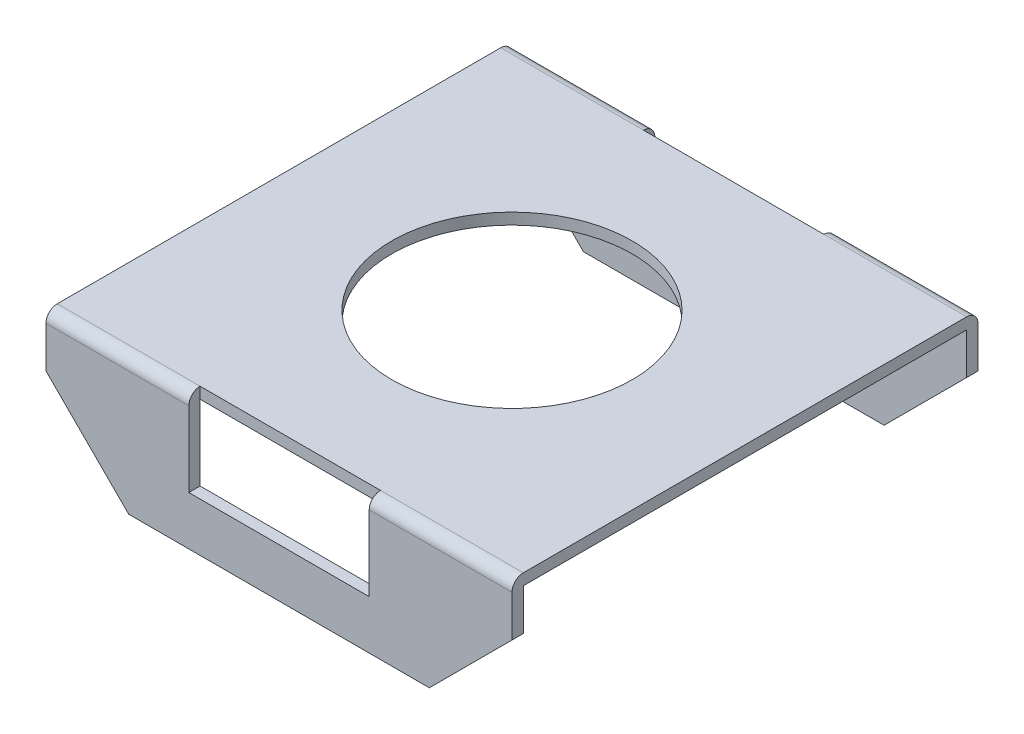
ISO-10303-21;
HEADER;
FILE_DESCRIPTION(('STEP AP214'),'2;1');
FILE_NAME('part.step','',(''),(''),'','','');
FILE_SCHEMA(('AUTOMOTIVE_DESIGN { 1 0 10303 214 1 1 1 1 }'));
ENDSEC;
DATA;
#1=APPLICATION_CONTEXT('core data for automotive mechanical design processes');
#2=APPLICATION_PROTOCOL_DEFINITION('international standard','automotive_design',2000,#1);
#3=PRODUCT_CONTEXT('',#1,'mechanical');
#4=PRODUCT('Part','Part','',(#3));
#5=PRODUCT_RELATED_PRODUCT_CATEGORY('part','',(#4));
#6=PRODUCT_DEFINITION_FORMATION('','',#4);
#7=PRODUCT_DEFINITION_CONTEXT('part definition',#1,'design');
#8=PRODUCT_DEFINITION('design','',#6,#7);
#9=PRODUCT_DEFINITION_SHAPE('','',#8);
#10=(LENGTH_UNIT() NAMED_UNIT(*) SI_UNIT(.MILLI.,.METRE.));
#11=(NAMED_UNIT(*) PLANE_ANGLE_UNIT() SI_UNIT($,.RADIAN.));
#12=(NAMED_UNIT(*) SI_UNIT($,.STERADIAN.) SOLID_ANGLE_UNIT());
#13=UNCERTAINTY_MEASURE_WITH_UNIT(LENGTH_MEASURE(1.E-05),#10,'distance_accuracy_value','');
#14=(GEOMETRIC_REPRESENTATION_CONTEXT(3) GLOBAL_UNCERTAINTY_ASSIGNED_CONTEXT((#13)) GLOBAL_UNIT_ASSIGNED_CONTEXT((#10,
#11,#12)) REPRESENTATION_CONTEXT('',''));
#15=CARTESIAN_POINT('',(0.,0.,0.));
#16=DIRECTION('',(0.,0.,1.));
#17=DIRECTION('',(1.,0.,0.));
#18=AXIS2_PLACEMENT_3D('',#15,#16,#17);
#19=CARTESIAN_POINT('',(3.1,2.,-2.95));
#20=DIRECTION('',(0.,0.,-1.));
#21=DIRECTION('',(-1.,0.,0.));
#22=AXIS2_PLACEMENT_3D('',#19,#20,#21);
#23=PLANE('',#22);
#24=DIRECTION('',(-1.,0.,0.));
#25=VECTOR('',#24,1.);
#26=CARTESIAN_POINT('',(3.1,0.2,-2.95));
#27=LINE('',#26,#25);
#28=CARTESIAN_POINT('',(2.,0.2,-2.95));
#29=VERTEX_POINT('',#28);
#30=CARTESIAN_POINT('',(-2.,0.2,-2.95));
#31=VERTEX_POINT('',#30);
#32=EDGE_CURVE('E295',#29,#31,#27,.T.);
#33=ORIENTED_EDGE('',*,*,#32,.F.);
#34=DIRECTION('',(0.707106781186551,0.707106781186544,0.));
#35=VECTOR('',#34,1.);
#36=CARTESIAN_POINT('',(3.45000000000001,1.64999999999999,-2.95));
#37=LINE('',#36,#35);
#38=CARTESIAN_POINT('',(3.1,1.29999999999999,-2.95));
#39=VERTEX_POINT('',#38);
#40=EDGE_CURVE('E376',#29,#39,#37,.T.);
#41=ORIENTED_EDGE('',*,*,#40,.T.);
#42=DIRECTION('',(0.,1.,0.));
#43=VECTOR('',#42,1.);
#44=CARTESIAN_POINT('',(3.1,2.,-2.95));
#45=LINE('',#44,#43);
#46=CARTESIAN_POINT('',(3.1,1.85,-2.95));
#47=VERTEX_POINT('',#46);
#48=EDGE_CURVE('E281',#47,#39,#45,.F.);
#49=ORIENTED_EDGE('',*,*,#48,.F.);
#50=DIRECTION('',(-1.,0.,0.));
#51=VECTOR('',#50,1.);
#52=CARTESIAN_POINT('',(3.1,1.85,-2.95));
#53=LINE('',#52,#51);
#54=CARTESIAN_POINT('',(1.2,1.85,-2.95));
#55=VERTEX_POINT('',#54);
#56=EDGE_CURVE('E282',#47,#55,#53,.T.);
#57=ORIENTED_EDGE('',*,*,#56,.T.);
#58=DIRECTION('',(0.,-1.,0.));
#59=VECTOR('',#58,1.);
#60=CARTESIAN_POINT('',(1.2,2.,-2.95));
#61=LINE('',#60,#59);
#62=CARTESIAN_POINT('',(1.2,0.85,-2.95));
#63=VERTEX_POINT('',#62);
#64=EDGE_CURVE('E326',#55,#63,#61,.T.);
#65=ORIENTED_EDGE('',*,*,#64,.T.);
#66=DIRECTION('',(-1.,0.,0.));
#67=VECTOR('',#66,1.);
#68=CARTESIAN_POINT('',(3.1,0.85,-2.95));
#69=LINE('',#68,#67);
#70=CARTESIAN_POINT('',(-1.2,0.85,-2.95));
#71=VERTEX_POINT('',#70);
#72=EDGE_CURVE('E331',#63,#71,#69,.T.);
#73=ORIENTED_EDGE('',*,*,#72,.T.);
#74=DIRECTION('',(0.,1.,0.));
#75=VECTOR('',#74,1.);
#76=CARTESIAN_POINT('',(-1.2,2.,-2.95));
#77=LINE('',#76,#75);
#78=CARTESIAN_POINT('',(-1.2,1.85,-2.95));
#79=VERTEX_POINT('',#78);
#80=EDGE_CURVE('E329',#71,#79,#77,.T.);
#81=ORIENTED_EDGE('',*,*,#80,.T.);
#82=CARTESIAN_POINT('',(-3.1,1.85,-2.95));
#83=VERTEX_POINT('',#82);
#84=EDGE_CURVE('E286',#79,#83,#53,.T.);
#85=ORIENTED_EDGE('',*,*,#84,.T.);
#86=DIRECTION('',(0.,1.,0.));
#87=VECTOR('',#86,1.);
#88=CARTESIAN_POINT('',(-3.1,2.,-2.95));
#89=LINE('',#88,#87);
#90=CARTESIAN_POINT('',(-3.1,1.29999999999999,-2.95));
#91=VERTEX_POINT('',#90);
#92=EDGE_CURVE('E334',#83,#91,#89,.F.);
#93=ORIENTED_EDGE('',*,*,#92,.T.);
#94=DIRECTION('',(0.707106781186552,-0.707106781186544,0.));
#95=VECTOR('',#94,1.);
#96=CARTESIAN_POINT('',(-0.349999999999971,-1.45000000000001,-2.95));
#97=LINE('',#96,#95);
#98=EDGE_CURVE('E364',#91,#31,#97,.T.);
#99=ORIENTED_EDGE('',*,*,#98,.T.);
#100=EDGE_LOOP('',(#33,#41,#49,#57,#65,#73,#81,#85,#93,#99));
#101=FACE_BOUND('',#100,.T.);
#102=ADVANCED_FACE('F32',(#101),#23,.F.);
#103=CARTESIAN_POINT('',(3.1,0.2,-3.1));
#104=DIRECTION('',(0.,-1.,0.));
#105=DIRECTION('',(0.,0.,-1.));
#106=AXIS2_PLACEMENT_3D('',#103,#104,#105);
#107=PLANE('',#106);
#108=DIRECTION('',(0.,0.,1.));
#109=VECTOR('',#108,1.);
#110=CARTESIAN_POINT('',(2.,0.2,-3.1));
#111=LINE('',#110,#109);
#112=CARTESIAN_POINT('',(2.,0.2,-3.1));
#113=VERTEX_POINT('',#112);
#114=EDGE_CURVE('E441',#113,#29,#111,.T.);
#115=ORIENTED_EDGE('',*,*,#114,.T.);
#116=ORIENTED_EDGE('',*,*,#32,.T.);
#117=DIRECTION('',(0.,0.,1.));
#118=VECTOR('',#117,1.);
#119=CARTESIAN_POINT('',(-2.,0.2,-3.1));
#120=LINE('',#119,#118);
#121=CARTESIAN_POINT('',(-2.,0.2,-3.1));
#122=VERTEX_POINT('',#121);
#123=EDGE_CURVE('E366',#122,#31,#120,.T.);
#124=ORIENTED_EDGE('',*,*,#123,.F.);
#125=DIRECTION('',(-1.,0.,0.));
#126=VECTOR('',#125,1.);
#127=CARTESIAN_POINT('',(3.1,0.2,-3.1));
#128=LINE('',#127,#126);
#129=EDGE_CURVE('E293',#113,#122,#128,.T.);
#130=ORIENTED_EDGE('',*,*,#129,.F.);
#131=EDGE_LOOP('',(#115,#116,#124,#130));
#132=FACE_BOUND('',#131,.T.);
#133=ADVANCED_FACE('F481',(#132),#107,.T.);
#134=CARTESIAN_POINT('',(3.1,2.,-3.1));
#135=DIRECTION('',(0.,0.,-1.));
#136=DIRECTION('',(-1.,0.,0.));
#137=AXIS2_PLACEMENT_3D('',#134,#135,#136);
#138=PLANE('',#137);
#139=DIRECTION('',(0.,-1.,0.));
#140=VECTOR('',#139,1.);
#141=CARTESIAN_POINT('',(-3.1,2.,-3.1));
#142=LINE('',#141,#140);
#143=CARTESIAN_POINT('',(-3.1,1.85,-3.1));
#144=VERTEX_POINT('',#143);
#145=CARTESIAN_POINT('',(-3.1,1.29999999999999,-3.1));
#146=VERTEX_POINT('',#145);
#147=EDGE_CURVE('E275',#144,#146,#142,.T.);
#148=ORIENTED_EDGE('',*,*,#147,.F.);
#149=DIRECTION('',(-1.,0.,0.));
#150=VECTOR('',#149,1.);
#151=CARTESIAN_POINT('',(3.1,1.85,-3.1));
#152=LINE('',#151,#150);
#153=CARTESIAN_POINT('',(-1.2,1.85,-3.1));
#154=VERTEX_POINT('',#153);
#155=EDGE_CURVE('E241',#144,#154,#152,.F.);
#156=ORIENTED_EDGE('',*,*,#155,.T.);
#157=DIRECTION('',(0.,-1.,0.));
#158=VECTOR('',#157,1.);
#159=CARTESIAN_POINT('',(-1.2,1.85,-3.1));
#160=LINE('',#159,#158);
#161=CARTESIAN_POINT('',(-1.2,0.85,-3.1));
#162=VERTEX_POINT('',#161);
#163=EDGE_CURVE('E387',#154,#162,#160,.T.);
#164=ORIENTED_EDGE('',*,*,#163,.T.);
#165=DIRECTION('',(1.,0.,0.));
#166=VECTOR('',#165,1.);
#167=CARTESIAN_POINT('',(-1.2,0.85,-3.1));
#168=LINE('',#167,#166);
#169=CARTESIAN_POINT('',(1.2,0.85,-3.1));
#170=VERTEX_POINT('',#169);
#171=EDGE_CURVE('E320',#162,#170,#168,.T.);
#172=ORIENTED_EDGE('',*,*,#171,.T.);
#173=DIRECTION('',(0.,1.,0.));
#174=VECTOR('',#173,1.);
#175=CARTESIAN_POINT('',(1.2,1.85,-3.1));
#176=LINE('',#175,#174);
#177=CARTESIAN_POINT('',(1.2,1.85,-3.1));
#178=VERTEX_POINT('',#177);
#179=EDGE_CURVE('E317',#170,#178,#176,.T.);
#180=ORIENTED_EDGE('',*,*,#179,.T.);
#181=DIRECTION('',(-1.,0.,0.));
#182=VECTOR('',#181,1.);
#183=CARTESIAN_POINT('',(3.1,1.85,-3.1));
#184=LINE('',#183,#182);
#185=CARTESIAN_POINT('',(3.1,1.85,-3.1));
#186=VERTEX_POINT('',#185);
#187=EDGE_CURVE('E239',#178,#186,#184,.F.);
#188=ORIENTED_EDGE('',*,*,#187,.T.);
#189=DIRECTION('',(0.,-1.,0.));
#190=VECTOR('',#189,1.);
#191=CARTESIAN_POINT('',(3.1,2.,-3.1));
#192=LINE('',#191,#190);
#193=CARTESIAN_POINT('',(3.1,1.29999999999999,-3.1));
#194=VERTEX_POINT('',#193);
#195=EDGE_CURVE('E337',#186,#194,#192,.T.);
#196=ORIENTED_EDGE('',*,*,#195,.T.);
#197=DIRECTION('',(-0.707106781186551,-0.707106781186544,0.));
#198=VECTOR('',#197,1.);
#199=CARTESIAN_POINT('',(3.1,1.29999999999999,-3.1));
#200=LINE('',#199,#198);
#201=EDGE_CURVE('E435',#194,#113,#200,.T.);
#202=ORIENTED_EDGE('',*,*,#201,.T.);
#203=ORIENTED_EDGE('',*,*,#129,.T.);
#204=DIRECTION('',(-0.707106781186551,0.707106781186543,0.));
#205=VECTOR('',#204,1.);
#206=CARTESIAN_POINT('',(-3.1,1.29999999999999,-3.1));
#207=LINE('',#206,#205);
#208=EDGE_CURVE('E361',#122,#146,#207,.T.);
#209=ORIENTED_EDGE('',*,*,#208,.T.);
#210=EDGE_LOOP('',(#148,#156,#164,#172,#180,#188,#196,#202,#203,#209));
#211=FACE_BOUND('',#210,.T.);
#212=ADVANCED_FACE('F368',(#211),#138,.T.);
#213=CARTESIAN_POINT('',(3.1,2.,3.1));
#214=DIRECTION('',(0.,1.,0.));
#215=DIRECTION('',(0.,0.,1.));
#216=AXIS2_PLACEMENT_3D('',#213,#214,#215);
#217=PLANE('',#216);
#218=CARTESIAN_POINT('',(0.,2.,0.));
#219=DIRECTION('',(0.,1.,0.));
#220=DIRECTION('',(0.,0.,1.));
#221=AXIS2_PLACEMENT_3D('',#218,#219,#220);
#222=CIRCLE('',#221,1.6);
#223=CARTESIAN_POINT('',(0.,2.,1.6));
#224=VERTEX_POINT('',#223);
#225=EDGE_CURVE('E709',#224,#224,#222,.T.);
#226=ORIENTED_EDGE('',*,*,#225,.F.);
#227=EDGE_LOOP('',(#226));
#228=FACE_BOUND('',#227,.T.);
#229=DIRECTION('',(1.,0.,0.));
#230=VECTOR('',#229,1.);
#231=CARTESIAN_POINT('',(-1.2,2.,-2.95));
#232=LINE('',#231,#230);
#233=CARTESIAN_POINT('',(-1.2,2.,-2.95));
#234=VERTEX_POINT('',#233);
#235=CARTESIAN_POINT('',(1.2,2.,-2.95));
#236=VERTEX_POINT('',#235);
#237=EDGE_CURVE('E425',#234,#236,#232,.T.);
#238=ORIENTED_EDGE('',*,*,#237,.F.);
#239=DIRECTION('',(-1.,0.,0.));
#240=VECTOR('',#239,1.);
#241=CARTESIAN_POINT('',(3.1,2.,-2.95));
#242=LINE('',#241,#240);
#243=CARTESIAN_POINT('',(-3.1,2.,-2.95));
#244=VERTEX_POINT('',#243);
#245=EDGE_CURVE('E232',#234,#244,#242,.T.);
#246=ORIENTED_EDGE('',*,*,#245,.T.);
#247=DIRECTION('',(0.,0.,-1.));
#248=VECTOR('',#247,1.);
#249=CARTESIAN_POINT('',(-3.1,2.,3.1));
#250=LINE('',#249,#248);
#251=CARTESIAN_POINT('',(-3.1,2.,2.95));
#252=VERTEX_POINT('',#251);
#253=EDGE_CURVE('E271',#252,#244,#250,.T.);
#254=ORIENTED_EDGE('',*,*,#253,.F.);
#255=DIRECTION('',(-1.,0.,0.));
#256=VECTOR('',#255,1.);
#257=CARTESIAN_POINT('',(3.1,2.,2.95));
#258=LINE('',#257,#256);
#259=CARTESIAN_POINT('',(-1.2,2.,2.95));
#260=VERTEX_POINT('',#259);
#261=EDGE_CURVE('E218',#252,#260,#258,.F.);
#262=ORIENTED_EDGE('',*,*,#261,.T.);
#263=DIRECTION('',(-1.,0.,0.));
#264=VECTOR('',#263,1.);
#265=CARTESIAN_POINT('',(-1.2,2.,2.95));
#266=LINE('',#265,#264);
#267=CARTESIAN_POINT('',(1.2,2.,2.95));
#268=VERTEX_POINT('',#267);
#269=EDGE_CURVE('E204',#268,#260,#266,.T.);
#270=ORIENTED_EDGE('',*,*,#269,.F.);
#271=DIRECTION('',(-1.,0.,0.));
#272=VECTOR('',#271,1.);
#273=CARTESIAN_POINT('',(3.1,2.,2.95));
#274=LINE('',#273,#272);
#275=CARTESIAN_POINT('',(3.1,2.,2.95));
#276=VERTEX_POINT('',#275);
#277=EDGE_CURVE('E214',#268,#276,#274,.F.);
#278=ORIENTED_EDGE('',*,*,#277,.T.);
#279=DIRECTION('',(0.,0.,-1.));
#280=VECTOR('',#279,1.);
#281=CARTESIAN_POINT('',(3.1,2.,3.1));
#282=LINE('',#281,#280);
#283=CARTESIAN_POINT('',(3.1,2.,-2.95));
#284=VERTEX_POINT('',#283);
#285=EDGE_CURVE('E339',#276,#284,#282,.T.);
#286=ORIENTED_EDGE('',*,*,#285,.T.);
#287=DIRECTION('',(-1.,0.,0.));
#288=VECTOR('',#287,1.);
#289=CARTESIAN_POINT('',(3.1,2.,-2.95));
#290=LINE('',#289,#288);
#291=EDGE_CURVE('E224',#284,#236,#290,.T.);
#292=ORIENTED_EDGE('',*,*,#291,.T.);
#293=EDGE_LOOP('',(#238,#246,#254,#262,#270,#278,#286,#292));
#294=FACE_BOUND('',#293,.T.);
#295=ADVANCED_FACE('F212',(#228,#294),#217,.T.);
#296=CARTESIAN_POINT('',(3.1,0.2,3.1));
#297=DIRECTION('',(0.,0.,1.));
#298=DIRECTION('',(1.,0.,0.));
#299=AXIS2_PLACEMENT_3D('',#296,#297,#298);
#300=PLANE('',#299);
#301=DIRECTION('',(0.,-1.,0.));
#302=VECTOR('',#301,1.);
#303=CARTESIAN_POINT('',(-1.2,1.85,3.1));
#304=LINE('',#303,#302);
#305=CARTESIAN_POINT('',(-1.2,1.85,3.1));
#306=VERTEX_POINT('',#305);
#307=CARTESIAN_POINT('',(-1.2,0.85,3.1));
#308=VERTEX_POINT('',#307);
#309=EDGE_CURVE('E263',#306,#308,#304,.T.);
#310=ORIENTED_EDGE('',*,*,#309,.F.);
#311=DIRECTION('',(-1.,0.,0.));
#312=VECTOR('',#311,1.);
#313=CARTESIAN_POINT('',(3.1,1.85,3.1));
#314=LINE('',#313,#312);
#315=CARTESIAN_POINT('',(-3.1,1.85,3.1));
#316=VERTEX_POINT('',#315);
#317=EDGE_CURVE('E252',#306,#316,#314,.T.);
#318=ORIENTED_EDGE('',*,*,#317,.T.);
#319=DIRECTION('',(0.,1.,0.));
#320=VECTOR('',#319,1.);
#321=CARTESIAN_POINT('',(-3.1,0.2,3.1));
#322=LINE('',#321,#320);
#323=CARTESIAN_POINT('',(-3.1,1.29999999999999,3.1));
#324=VERTEX_POINT('',#323);
#325=EDGE_CURVE('E261',#324,#316,#322,.T.);
#326=ORIENTED_EDGE('',*,*,#325,.F.);
#327=DIRECTION('',(-0.707106781186551,0.707106781186543,0.));
#328=VECTOR('',#327,1.);
#329=CARTESIAN_POINT('',(-3.1,1.29999999999999,3.1));
#330=LINE('',#329,#328);
#331=CARTESIAN_POINT('',(-2.,0.2,3.1));
#332=VERTEX_POINT('',#331);
#333=EDGE_CURVE('E372',#332,#324,#330,.T.);
#334=ORIENTED_EDGE('',*,*,#333,.F.);
#335=DIRECTION('',(-1.,0.,0.));
#336=VECTOR('',#335,1.);
#337=CARTESIAN_POINT('',(3.1,0.2,3.1));
#338=LINE('',#337,#336);
#339=CARTESIAN_POINT('',(2.,0.2,3.1));
#340=VERTEX_POINT('',#339);
#341=EDGE_CURVE('E291',#340,#332,#338,.T.);
#342=ORIENTED_EDGE('',*,*,#341,.F.);
#343=DIRECTION('',(-0.707106781186551,-0.707106781186544,0.));
#344=VECTOR('',#343,1.);
#345=CARTESIAN_POINT('',(3.1,1.29999999999999,3.1));
#346=LINE('',#345,#344);
#347=CARTESIAN_POINT('',(3.1,1.29999999999999,3.1));
#348=VERTEX_POINT('',#347);
#349=EDGE_CURVE('E405',#348,#340,#346,.T.);
#350=ORIENTED_EDGE('',*,*,#349,.F.);
#351=DIRECTION('',(0.,1.,0.));
#352=VECTOR('',#351,1.);
#353=CARTESIAN_POINT('',(3.1,0.2,3.1));
#354=LINE('',#353,#352);
#355=CARTESIAN_POINT('',(3.1,1.85,3.1));
#356=VERTEX_POINT('',#355);
#357=EDGE_CURVE('E341',#348,#356,#354,.T.);
#358=ORIENTED_EDGE('',*,*,#357,.T.);
#359=DIRECTION('',(-1.,0.,0.));
#360=VECTOR('',#359,1.);
#361=CARTESIAN_POINT('',(3.1,1.85,3.1));
#362=LINE('',#361,#360);
#363=CARTESIAN_POINT('',(1.2,1.85,3.1));
#364=VERTEX_POINT('',#363);
#365=EDGE_CURVE('E250',#356,#364,#362,.T.);
#366=ORIENTED_EDGE('',*,*,#365,.T.);
#367=DIRECTION('',(0.,1.,0.));
#368=VECTOR('',#367,1.);
#369=CARTESIAN_POINT('',(1.2,1.85,3.1));
#370=LINE('',#369,#368);
#371=CARTESIAN_POINT('',(1.2,0.85,3.1));
#372=VERTEX_POINT('',#371);
#373=EDGE_CURVE('E199',#372,#364,#370,.T.);
#374=ORIENTED_EDGE('',*,*,#373,.F.);
#375=DIRECTION('',(1.,0.,0.));
#376=VECTOR('',#375,1.);
#377=CARTESIAN_POINT('',(-1.2,0.85,3.1));
#378=LINE('',#377,#376);
#379=EDGE_CURVE('E384',#308,#372,#378,.T.);
#380=ORIENTED_EDGE('',*,*,#379,.F.);
#381=EDGE_LOOP('',(#310,#318,#326,#334,#342,#350,#358,#366,#374,#380));
#382=FACE_BOUND('',#381,.T.);
#383=ADVANCED_FACE('F259',(#382),#300,.T.);
#384=CARTESIAN_POINT('',(3.1,0.2,2.95));
#385=DIRECTION('',(0.,-1.,0.));
#386=DIRECTION('',(0.,0.,-1.));
#387=AXIS2_PLACEMENT_3D('',#384,#385,#386);
#388=PLANE('',#387);
#389=CARTESIAN_POINT('',(2.,0.2,2.95));
#390=VERTEX_POINT('',#389);
#391=EDGE_CURVE('E437',#390,#340,#111,.T.);
#392=ORIENTED_EDGE('',*,*,#391,.T.);
#393=ORIENTED_EDGE('',*,*,#341,.T.);
#394=CARTESIAN_POINT('',(-2.,0.2,2.95));
#395=VERTEX_POINT('',#394);
#396=EDGE_CURVE('E371',#395,#332,#120,.T.);
#397=ORIENTED_EDGE('',*,*,#396,.F.);
#398=DIRECTION('',(-1.,0.,0.));
#399=VECTOR('',#398,1.);
#400=CARTESIAN_POINT('',(3.1,0.2,2.95));
#401=LINE('',#400,#399);
#402=EDGE_CURVE('E289',#390,#395,#401,.T.);
#403=ORIENTED_EDGE('',*,*,#402,.F.);
#404=EDGE_LOOP('',(#392,#393,#397,#403));
#405=FACE_BOUND('',#404,.T.);
#406=ADVANCED_FACE('F468',(#405),#388,.T.);
#407=CARTESIAN_POINT('',(3.1,0.2,2.95));
#408=DIRECTION('',(0.,0.,1.));
#409=DIRECTION('',(1.,0.,0.));
#410=AXIS2_PLACEMENT_3D('',#407,#408,#409);
#411=PLANE('',#410);
#412=DIRECTION('',(0.,1.,0.));
#413=VECTOR('',#412,1.);
#414=CARTESIAN_POINT('',(3.1,0.2,2.95));
#415=LINE('',#414,#413);
#416=CARTESIAN_POINT('',(3.1,1.29999999999999,2.95));
#417=VERTEX_POINT('',#416);
#418=CARTESIAN_POINT('',(3.1,1.85,2.95));
#419=VERTEX_POINT('',#418);
#420=EDGE_CURVE('E344',#417,#419,#415,.T.);
#421=ORIENTED_EDGE('',*,*,#420,.F.);
#422=DIRECTION('',(-0.707106781186551,-0.707106781186544,0.));
#423=VECTOR('',#422,1.);
#424=CARTESIAN_POINT('',(2.55000000000001,0.75,2.95));
#425=LINE('',#424,#423);
#426=EDGE_CURVE('E440',#417,#390,#425,.T.);
#427=ORIENTED_EDGE('',*,*,#426,.T.);
#428=ORIENTED_EDGE('',*,*,#402,.T.);
#429=DIRECTION('',(-0.707106781186552,0.707106781186544,0.));
#430=VECTOR('',#429,1.);
#431=CARTESIAN_POINT('',(0.550000000000029,-2.35,2.95));
#432=LINE('',#431,#430);
#433=CARTESIAN_POINT('',(-3.1,1.29999999999999,2.95));
#434=VERTEX_POINT('',#433);
#435=EDGE_CURVE('E365',#395,#434,#432,.T.);
#436=ORIENTED_EDGE('',*,*,#435,.T.);
#437=DIRECTION('',(0.,1.,0.));
#438=VECTOR('',#437,1.);
#439=CARTESIAN_POINT('',(-3.1,0.2,2.95));
#440=LINE('',#439,#438);
#441=CARTESIAN_POINT('',(-3.1,1.85,2.95));
#442=VERTEX_POINT('',#441);
#443=EDGE_CURVE('E270',#434,#442,#440,.T.);
#444=ORIENTED_EDGE('',*,*,#443,.T.);
#445=DIRECTION('',(-1.,0.,0.));
#446=VECTOR('',#445,1.);
#447=CARTESIAN_POINT('',(3.1,1.85,2.95));
#448=LINE('',#447,#446);
#449=CARTESIAN_POINT('',(-1.2,1.85,2.95));
#450=VERTEX_POINT('',#449);
#451=EDGE_CURVE('E285',#450,#442,#448,.T.);
#452=ORIENTED_EDGE('',*,*,#451,.F.);
#453=DIRECTION('',(0.,-1.,0.));
#454=VECTOR('',#453,1.);
#455=CARTESIAN_POINT('',(-1.2,0.200000000000001,2.95));
#456=LINE('',#455,#454);
#457=CARTESIAN_POINT('',(-1.2,0.85,2.95));
#458=VERTEX_POINT('',#457);
#459=EDGE_CURVE('E307',#450,#458,#456,.T.);
#460=ORIENTED_EDGE('',*,*,#459,.T.);
#461=DIRECTION('',(1.,0.,0.));
#462=VECTOR('',#461,1.);
#463=CARTESIAN_POINT('',(3.1,0.85,2.95));
#464=LINE('',#463,#462);
#465=CARTESIAN_POINT('',(1.2,0.85,2.95));
#466=VERTEX_POINT('',#465);
#467=EDGE_CURVE('E297',#458,#466,#464,.T.);
#468=ORIENTED_EDGE('',*,*,#467,.T.);
#469=DIRECTION('',(0.,1.,0.));
#470=VECTOR('',#469,1.);
#471=CARTESIAN_POINT('',(1.2,0.200000000000001,2.95));
#472=LINE('',#471,#470);
#473=CARTESIAN_POINT('',(1.2,1.85,2.95));
#474=VERTEX_POINT('',#473);
#475=EDGE_CURVE('E304',#466,#474,#472,.T.);
#476=ORIENTED_EDGE('',*,*,#475,.T.);
#477=EDGE_CURVE('E287',#419,#474,#448,.T.);
#478=ORIENTED_EDGE('',*,*,#477,.F.);
#479=EDGE_LOOP('',(#421,#427,#428,#436,#444,#452,#460,#468,#476,#478));
#480=FACE_BOUND('',#479,.T.);
#481=ADVANCED_FACE('F302',(#480),#411,.F.);
#482=CARTESIAN_POINT('',(3.1,1.85,3.1));
#483=DIRECTION('',(0.,1.,0.));
#484=DIRECTION('',(0.,0.,1.));
#485=AXIS2_PLACEMENT_3D('',#482,#483,#484);
#486=PLANE('',#485);
#487=CARTESIAN_POINT('',(0.,1.85,0.));
#488=DIRECTION('',(0.,1.,0.));
#489=DIRECTION('',(0.,0.,1.));
#490=AXIS2_PLACEMENT_3D('',#487,#488,#489);
#491=CIRCLE('',#490,1.6);
#492=CARTESIAN_POINT('',(0.,1.85,1.6));
#493=VERTEX_POINT('',#492);
#494=EDGE_CURVE('E36',#493,#493,#491,.T.);
#495=ORIENTED_EDGE('',*,*,#494,.T.);
#496=EDGE_LOOP('',(#495));
#497=FACE_BOUND('',#496,.T.);
#498=ORIENTED_EDGE('',*,*,#477,.T.);
#499=DIRECTION('',(-1.,0.,0.));
#500=VECTOR('',#499,1.);
#501=CARTESIAN_POINT('',(3.1,1.85,2.95));
#502=LINE('',#501,#500);
#503=EDGE_CURVE('E206',#474,#450,#502,.T.);
#504=ORIENTED_EDGE('',*,*,#503,.T.);
#505=ORIENTED_EDGE('',*,*,#451,.T.);
#506=DIRECTION('',(0.,0.,-1.));
#507=VECTOR('',#506,1.);
#508=CARTESIAN_POINT('',(-3.1,1.85,3.1));
#509=LINE('',#508,#507);
#510=EDGE_CURVE('E273',#442,#83,#509,.T.);
#511=ORIENTED_EDGE('',*,*,#510,.T.);
#512=ORIENTED_EDGE('',*,*,#84,.F.);
#513=DIRECTION('',(1.,0.,0.));
#514=VECTOR('',#513,1.);
#515=CARTESIAN_POINT('',(3.1,1.85,-2.95));
#516=LINE('',#515,#514);
#517=EDGE_CURVE('E421',#79,#55,#516,.T.);
#518=ORIENTED_EDGE('',*,*,#517,.T.);
#519=ORIENTED_EDGE('',*,*,#56,.F.);
#520=DIRECTION('',(0.,0.,-1.));
#521=VECTOR('',#520,1.);
#522=CARTESIAN_POINT('',(3.1,1.85,3.1));
#523=LINE('',#522,#521);
#524=EDGE_CURVE('E346',#419,#47,#523,.T.);
#525=ORIENTED_EDGE('',*,*,#524,.F.);
#526=EDGE_LOOP('',(#498,#504,#505,#511,#512,#518,#519,#525));
#527=FACE_BOUND('',#526,.T.);
#528=ADVANCED_FACE('F454',(#497,#527),#486,.F.);
#529=CARTESIAN_POINT('',(3.1,0.,0.));
#530=DIRECTION('',(1.,0.,0.));
#531=DIRECTION('',(0.,0.,-1.));
#532=AXIS2_PLACEMENT_3D('',#529,#530,#531);
#533=PLANE('',#532);
#534=ORIENTED_EDGE('',*,*,#195,.F.);
#535=CARTESIAN_POINT('',(3.1,1.85,-2.95));
#536=DIRECTION('',(1.,0.,0.));
#537=DIRECTION('',(0.,0.,-1.));
#538=AXIS2_PLACEMENT_3D('',#535,#536,#537);
#539=CIRCLE('',#538,0.15);
#540=EDGE_CURVE('E248',#186,#284,#539,.T.);
#541=ORIENTED_EDGE('',*,*,#540,.T.);
#542=ORIENTED_EDGE('',*,*,#285,.F.);
#543=CARTESIAN_POINT('',(3.1,1.85,2.95));
#544=DIRECTION('',(1.,0.,0.));
#545=DIRECTION('',(0.,0.,-1.));
#546=AXIS2_PLACEMENT_3D('',#543,#544,#545);
#547=CIRCLE('',#546,0.15);
#548=EDGE_CURVE('E221',#276,#356,#547,.T.);
#549=ORIENTED_EDGE('',*,*,#548,.T.);
#550=ORIENTED_EDGE('',*,*,#357,.F.);
#551=DIRECTION('',(0.,0.,1.));
#552=VECTOR('',#551,1.);
#553=CARTESIAN_POINT('',(3.1,1.29999999999999,0.));
#554=LINE('',#553,#552);
#555=EDGE_CURVE('E222',#417,#348,#554,.T.);
#556=ORIENTED_EDGE('',*,*,#555,.F.);
#557=ORIENTED_EDGE('',*,*,#420,.T.);
#558=ORIENTED_EDGE('',*,*,#524,.T.);
#559=ORIENTED_EDGE('',*,*,#48,.T.);
#560=DIRECTION('',(0.,0.,1.));
#561=VECTOR('',#560,1.);
#562=CARTESIAN_POINT('',(3.1,1.29999999999999,-3.1));
#563=LINE('',#562,#561);
#564=EDGE_CURVE('E438',#194,#39,#563,.T.);
#565=ORIENTED_EDGE('',*,*,#564,.F.);
#566=EDGE_LOOP('',(#534,#541,#542,#549,#550,#556,#557,#558,#559,#565));
#567=FACE_BOUND('',#566,.T.);
#568=ADVANCED_FACE('F409',(#567),#533,.T.);
#569=CARTESIAN_POINT('',(-3.1,0.,0.));
#570=DIRECTION('',(1.,0.,0.));
#571=DIRECTION('',(0.,0.,-1.));
#572=AXIS2_PLACEMENT_3D('',#569,#570,#571);
#573=PLANE('',#572);
#574=ORIENTED_EDGE('',*,*,#253,.T.);
#575=CARTESIAN_POINT('',(-3.1,1.85,-2.95));
#576=DIRECTION('',(1.,0.,0.));
#577=DIRECTION('',(0.,0.,-1.));
#578=AXIS2_PLACEMENT_3D('',#575,#576,#577);
#579=CIRCLE('',#578,0.15);
#580=EDGE_CURVE('E237',#244,#144,#579,.F.);
#581=ORIENTED_EDGE('',*,*,#580,.T.);
#582=ORIENTED_EDGE('',*,*,#147,.T.);
#583=DIRECTION('',(0.,0.,1.));
#584=VECTOR('',#583,1.);
#585=CARTESIAN_POINT('',(-3.1,1.29999999999999,-3.1));
#586=LINE('',#585,#584);
#587=EDGE_CURVE('E353',#146,#91,#586,.T.);
#588=ORIENTED_EDGE('',*,*,#587,.T.);
#589=ORIENTED_EDGE('',*,*,#92,.F.);
#590=ORIENTED_EDGE('',*,*,#510,.F.);
#591=ORIENTED_EDGE('',*,*,#443,.F.);
#592=DIRECTION('',(0.,0.,1.));
#593=VECTOR('',#592,1.);
#594=CARTESIAN_POINT('',(-3.1,1.29999999999999,0.));
#595=LINE('',#594,#593);
#596=EDGE_CURVE('E226',#434,#324,#595,.T.);
#597=ORIENTED_EDGE('',*,*,#596,.T.);
#598=ORIENTED_EDGE('',*,*,#325,.T.);
#599=CARTESIAN_POINT('',(-3.1,1.85,2.95));
#600=DIRECTION('',(1.,0.,0.));
#601=DIRECTION('',(0.,0.,-1.));
#602=AXIS2_PLACEMENT_3D('',#599,#600,#601);
#603=CIRCLE('',#602,0.15);
#604=EDGE_CURVE('E235',#316,#252,#603,.F.);
#605=ORIENTED_EDGE('',*,*,#604,.T.);
#606=EDGE_LOOP('',(#574,#581,#582,#588,#589,#590,#591,#597,#598,#605));
#607=FACE_BOUND('',#606,.T.);
#608=ADVANCED_FACE('F268',(#607),#573,.F.);
#609=CARTESIAN_POINT('',(-1.2,0.85,-3.1));
#610=DIRECTION('',(0.,-1.,0.));
#611=DIRECTION('',(0.,0.,-1.));
#612=AXIS2_PLACEMENT_3D('',#609,#610,#611);
#613=PLANE('',#612);
#614=DIRECTION('',(0.,0.,1.));
#615=VECTOR('',#614,1.);
#616=CARTESIAN_POINT('',(-1.2,0.85,-3.1));
#617=LINE('',#616,#615);
#618=EDGE_CURVE('E313',#458,#308,#617,.T.);
#619=ORIENTED_EDGE('',*,*,#618,.T.);
#620=ORIENTED_EDGE('',*,*,#379,.T.);
#621=DIRECTION('',(0.,0.,1.));
#622=VECTOR('',#621,1.);
#623=CARTESIAN_POINT('',(1.2,0.85,-3.1));
#624=LINE('',#623,#622);
#625=EDGE_CURVE('E314',#466,#372,#624,.T.);
#626=ORIENTED_EDGE('',*,*,#625,.F.);
#627=ORIENTED_EDGE('',*,*,#467,.F.);
#628=EDGE_LOOP('',(#619,#620,#626,#627));
#629=FACE_BOUND('',#628,.T.);
#630=ADVANCED_FACE('F311',(#629),#613,.F.);
#631=CARTESIAN_POINT('',(1.2,1.85,-3.1));
#632=DIRECTION('',(1.,0.,0.));
#633=DIRECTION('',(0.,1.,0.));
#634=AXIS2_PLACEMENT_3D('',#631,#632,#633);
#635=PLANE('',#634);
#636=ORIENTED_EDGE('',*,*,#373,.T.);
#637=CARTESIAN_POINT('',(1.2,1.85,2.95));
#638=DIRECTION('',(1.,0.,0.));
#639=DIRECTION('',(0.,1.,0.));
#640=AXIS2_PLACEMENT_3D('',#637,#638,#639);
#641=CIRCLE('',#640,0.15);
#642=EDGE_CURVE('E11',#364,#268,#641,.F.);
#643=ORIENTED_EDGE('',*,*,#642,.T.);
#644=DIRECTION('',(0.,1.,0.));
#645=VECTOR('',#644,1.);
#646=CARTESIAN_POINT('',(1.2,1.,2.95));
#647=LINE('',#646,#645);
#648=EDGE_CURVE('E196',#474,#268,#647,.T.);
#649=ORIENTED_EDGE('',*,*,#648,.F.);
#650=ORIENTED_EDGE('',*,*,#475,.F.);
#651=ORIENTED_EDGE('',*,*,#625,.T.);
#652=EDGE_LOOP('',(#636,#643,#649,#650,#651));
#653=FACE_BOUND('',#652,.T.);
#654=ADVANCED_FACE('F194',(#653),#635,.F.);
#655=CARTESIAN_POINT('',(-1.2,1.85,-3.1));
#656=DIRECTION('',(-1.,0.,0.));
#657=DIRECTION('',(0.,-1.,0.));
#658=AXIS2_PLACEMENT_3D('',#655,#656,#657);
#659=PLANE('',#658);
#660=DIRECTION('',(0.,1.,0.));
#661=VECTOR('',#660,1.);
#662=CARTESIAN_POINT('',(-1.2,1.,2.95));
#663=LINE('',#662,#661);
#664=EDGE_CURVE('E208',#450,#260,#663,.T.);
#665=ORIENTED_EDGE('',*,*,#664,.T.);
#666=CARTESIAN_POINT('',(-1.2,1.85,2.95));
#667=DIRECTION('',(-1.,0.,0.));
#668=DIRECTION('',(0.,-1.,0.));
#669=AXIS2_PLACEMENT_3D('',#666,#667,#668);
#670=CIRCLE('',#669,0.15);
#671=EDGE_CURVE('E41',#260,#306,#670,.F.);
#672=ORIENTED_EDGE('',*,*,#671,.T.);
#673=ORIENTED_EDGE('',*,*,#309,.T.);
#674=ORIENTED_EDGE('',*,*,#618,.F.);
#675=ORIENTED_EDGE('',*,*,#459,.F.);
#676=EDGE_LOOP('',(#665,#672,#673,#674,#675));
#677=FACE_BOUND('',#676,.T.);
#678=ADVANCED_FACE('F315',(#677),#659,.F.);
#679=EDGE_CURVE('E324',#170,#63,#624,.T.);
#680=ORIENTED_EDGE('',*,*,#679,.F.);
#681=ORIENTED_EDGE('',*,*,#171,.F.);
#682=EDGE_CURVE('E316',#162,#71,#617,.T.);
#683=ORIENTED_EDGE('',*,*,#682,.T.);
#684=ORIENTED_EDGE('',*,*,#72,.F.);
#685=EDGE_LOOP('',(#680,#681,#683,#684));
#686=FACE_BOUND('',#685,.T.);
#687=ADVANCED_FACE('F396',(#686),#613,.F.);
#688=ORIENTED_EDGE('',*,*,#163,.F.);
#689=CARTESIAN_POINT('',(-1.2,1.85,-2.95));
#690=DIRECTION('',(-1.,0.,0.));
#691=DIRECTION('',(0.,-1.,0.));
#692=AXIS2_PLACEMENT_3D('',#689,#690,#691);
#693=CIRCLE('',#692,0.15);
#694=EDGE_CURVE('E243',#154,#234,#693,.F.);
#695=ORIENTED_EDGE('',*,*,#694,.T.);
#696=DIRECTION('',(0.,1.,0.));
#697=VECTOR('',#696,1.);
#698=CARTESIAN_POINT('',(-1.2,1.,-2.95));
#699=LINE('',#698,#697);
#700=EDGE_CURVE('E422',#79,#234,#699,.T.);
#701=ORIENTED_EDGE('',*,*,#700,.F.);
#702=ORIENTED_EDGE('',*,*,#80,.F.);
#703=ORIENTED_EDGE('',*,*,#682,.F.);
#704=EDGE_LOOP('',(#688,#695,#701,#702,#703));
#705=FACE_BOUND('',#704,.T.);
#706=ADVANCED_FACE('F457',(#705),#659,.F.);
#707=DIRECTION('',(0.,1.,0.));
#708=VECTOR('',#707,1.);
#709=CARTESIAN_POINT('',(1.2,1.,-2.95));
#710=LINE('',#709,#708);
#711=EDGE_CURVE('E416',#55,#236,#710,.T.);
#712=ORIENTED_EDGE('',*,*,#711,.T.);
#713=CARTESIAN_POINT('',(1.2,1.85,-2.95));
#714=DIRECTION('',(1.,0.,0.));
#715=DIRECTION('',(0.,1.,0.));
#716=AXIS2_PLACEMENT_3D('',#713,#714,#715);
#717=CIRCLE('',#716,0.15);
#718=EDGE_CURVE('E245',#236,#178,#717,.F.);
#719=ORIENTED_EDGE('',*,*,#718,.T.);
#720=ORIENTED_EDGE('',*,*,#179,.F.);
#721=ORIENTED_EDGE('',*,*,#679,.T.);
#722=ORIENTED_EDGE('',*,*,#64,.F.);
#723=EDGE_LOOP('',(#712,#719,#720,#721,#722));
#724=FACE_BOUND('',#723,.T.);
#725=ADVANCED_FACE('F415',(#724),#635,.F.);
#726=CARTESIAN_POINT('',(-3.1,1.29999999999999,-3.1));
#727=DIRECTION('',(0.707106781186544,0.707106781186552,0.));
#728=DIRECTION('',(-0.707106781186552,0.707106781186544,0.));
#729=AXIS2_PLACEMENT_3D('',#726,#727,#728);
#730=PLANE('',#729);
#731=ORIENTED_EDGE('',*,*,#396,.T.);
#732=ORIENTED_EDGE('',*,*,#333,.T.);
#733=ORIENTED_EDGE('',*,*,#596,.F.);
#734=ORIENTED_EDGE('',*,*,#435,.F.);
#735=EDGE_LOOP('',(#731,#732,#733,#734));
#736=FACE_BOUND('',#735,.T.);
#737=ADVANCED_FACE('F465',(#736),#730,.F.);
#738=ORIENTED_EDGE('',*,*,#587,.F.);
#739=ORIENTED_EDGE('',*,*,#208,.F.);
#740=ORIENTED_EDGE('',*,*,#123,.T.);
#741=ORIENTED_EDGE('',*,*,#98,.F.);
#742=EDGE_LOOP('',(#738,#739,#740,#741));
#743=FACE_BOUND('',#742,.T.);
#744=ADVANCED_FACE('F359',(#743),#730,.F.);
#745=CARTESIAN_POINT('',(3.1,1.29999999999999,-3.1));
#746=DIRECTION('',(-0.707106781186544,0.707106781186551,0.));
#747=DIRECTION('',(-0.707106781186551,-0.707106781186544,0.));
#748=AXIS2_PLACEMENT_3D('',#745,#746,#747);
#749=PLANE('',#748);
#750=ORIENTED_EDGE('',*,*,#555,.T.);
#751=ORIENTED_EDGE('',*,*,#349,.T.);
#752=ORIENTED_EDGE('',*,*,#391,.F.);
#753=ORIENTED_EDGE('',*,*,#426,.F.);
#754=EDGE_LOOP('',(#750,#751,#752,#753));
#755=FACE_BOUND('',#754,.T.);
#756=ADVANCED_FACE('F470',(#755),#749,.F.);
#757=ORIENTED_EDGE('',*,*,#114,.F.);
#758=ORIENTED_EDGE('',*,*,#201,.F.);
#759=ORIENTED_EDGE('',*,*,#564,.T.);
#760=ORIENTED_EDGE('',*,*,#40,.F.);
#761=EDGE_LOOP('',(#757,#758,#759,#760));
#762=FACE_BOUND('',#761,.T.);
#763=ADVANCED_FACE('F472',(#762),#749,.F.);
#764=CARTESIAN_POINT('',(-1.2,1.,-2.95));
#765=DIRECTION('',(0.,0.,1.));
#766=DIRECTION('',(1.,0.,0.));
#767=AXIS2_PLACEMENT_3D('',#764,#765,#766);
#768=PLANE('',#767);
#769=ORIENTED_EDGE('',*,*,#700,.T.);
#770=ORIENTED_EDGE('',*,*,#237,.T.);
#771=ORIENTED_EDGE('',*,*,#711,.F.);
#772=ORIENTED_EDGE('',*,*,#517,.F.);
#773=EDGE_LOOP('',(#769,#770,#771,#772));
#774=FACE_BOUND('',#773,.T.);
#775=ADVANCED_FACE('F426',(#774),#768,.F.);
#776=CARTESIAN_POINT('',(-1.2,1.,2.95));
#777=DIRECTION('',(0.,0.,-1.));
#778=DIRECTION('',(-1.,0.,0.));
#779=AXIS2_PLACEMENT_3D('',#776,#777,#778);
#780=PLANE('',#779);
#781=ORIENTED_EDGE('',*,*,#648,.T.);
#782=ORIENTED_EDGE('',*,*,#269,.T.);
#783=ORIENTED_EDGE('',*,*,#664,.F.);
#784=ORIENTED_EDGE('',*,*,#503,.F.);
#785=EDGE_LOOP('',(#781,#782,#783,#784));
#786=FACE_BOUND('',#785,.T.);
#787=ADVANCED_FACE('F203',(#786),#780,.F.);
#788=CARTESIAN_POINT('',(3.1,1.85,-2.95));
#789=DIRECTION('',(-1.,0.,0.));
#790=DIRECTION('',(0.,0.,1.));
#791=AXIS2_PLACEMENT_3D('',#788,#789,#790);
#792=CYLINDRICAL_SURFACE('',#791,0.15);
#793=ORIENTED_EDGE('',*,*,#694,.F.);
#794=ORIENTED_EDGE('',*,*,#155,.F.);
#795=ORIENTED_EDGE('',*,*,#580,.F.);
#796=ORIENTED_EDGE('',*,*,#245,.F.);
#797=EDGE_LOOP('',(#793,#794,#795,#796));
#798=FACE_BOUND('',#797,.T.);
#799=ADVANCED_FACE('F490',(#798),#792,.T.);
#800=CARTESIAN_POINT('',(3.1,1.85,-2.95));
#801=DIRECTION('',(-1.,0.,0.));
#802=DIRECTION('',(0.,0.,1.));
#803=AXIS2_PLACEMENT_3D('',#800,#801,#802);
#804=CYLINDRICAL_SURFACE('',#803,0.15);
#805=ORIENTED_EDGE('',*,*,#540,.F.);
#806=ORIENTED_EDGE('',*,*,#187,.F.);
#807=ORIENTED_EDGE('',*,*,#718,.F.);
#808=ORIENTED_EDGE('',*,*,#291,.F.);
#809=EDGE_LOOP('',(#805,#806,#807,#808));
#810=FACE_BOUND('',#809,.T.);
#811=ADVANCED_FACE('F414',(#810),#804,.T.);
#812=CARTESIAN_POINT('',(3.1,1.85,2.95));
#813=DIRECTION('',(-1.,0.,0.));
#814=DIRECTION('',(0.,0.,1.));
#815=AXIS2_PLACEMENT_3D('',#812,#813,#814);
#816=CYLINDRICAL_SURFACE('',#815,0.15);
#817=ORIENTED_EDGE('',*,*,#671,.F.);
#818=ORIENTED_EDGE('',*,*,#261,.F.);
#819=ORIENTED_EDGE('',*,*,#604,.F.);
#820=ORIENTED_EDGE('',*,*,#317,.F.);
#821=EDGE_LOOP('',(#817,#818,#819,#820));
#822=FACE_BOUND('',#821,.T.);
#823=ADVANCED_FACE('F495',(#822),#816,.T.);
#824=CARTESIAN_POINT('',(3.1,1.85,2.95));
#825=DIRECTION('',(-1.,0.,0.));
#826=DIRECTION('',(0.,0.,1.));
#827=AXIS2_PLACEMENT_3D('',#824,#825,#826);
#828=CYLINDRICAL_SURFACE('',#827,0.15);
#829=ORIENTED_EDGE('',*,*,#548,.F.);
#830=ORIENTED_EDGE('',*,*,#277,.F.);
#831=ORIENTED_EDGE('',*,*,#642,.F.);
#832=ORIENTED_EDGE('',*,*,#365,.F.);
#833=EDGE_LOOP('',(#829,#830,#831,#832));
#834=FACE_BOUND('',#833,.T.);
#835=ADVANCED_FACE('F34',(#834),#828,.T.);
#836=CARTESIAN_POINT('',(0.,1.,0.));
#837=DIRECTION('',(0.,1.,0.));
#838=DIRECTION('',(0.,0.,1.));
#839=AXIS2_PLACEMENT_3D('',#836,#837,#838);
#840=CYLINDRICAL_SURFACE('',#839,1.6);
#841=ORIENTED_EDGE('',*,*,#225,.T.);
#842=EDGE_LOOP('',(#841));
#843=FACE_BOUND('',#842,.T.);
#844=ORIENTED_EDGE('',*,*,#494,.F.);
#845=EDGE_LOOP('',(#844));
#846=FACE_BOUND('',#845,.T.);
#847=ADVANCED_FACE('F500',(#843,#846),#840,.F.);
#848=CLOSED_SHELL('',(#102,#133,#212,#295,#383,#406,#481,#528,#568,#608,#630,#654,#678,#687,
#706,#725,#737,#744,#756,#763,#775,#787,#799,#811,#823,#835,#847));
#849=MANIFOLD_SOLID_BREP('B2',#848);
#850=ADVANCED_BREP_SHAPE_REPRESENTATION('',(#18,#849),#14);
#851=SHAPE_DEFINITION_REPRESENTATION(#9,#850);
ENDSEC;
END-ISO-10303-21;
